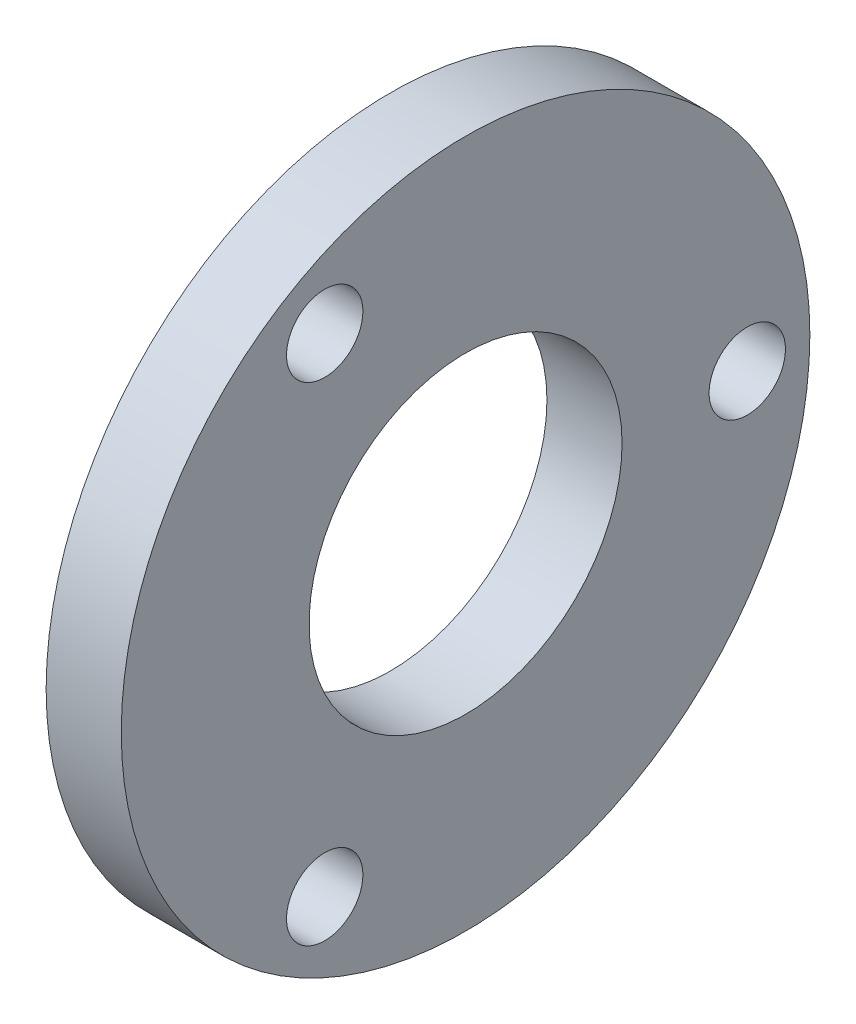
ISO-10303-21;
HEADER;
FILE_DESCRIPTION(('STEP AP214'),'2;1');
FILE_NAME('part.step','',(''),(''),'','','');
FILE_SCHEMA(('AUTOMOTIVE_DESIGN { 1 0 10303 214 1 1 1 1 }'));
ENDSEC;
DATA;
#1=APPLICATION_CONTEXT('core data for automotive mechanical design processes');
#2=APPLICATION_PROTOCOL_DEFINITION('international standard','automotive_design',2000,#1);
#3=PRODUCT_CONTEXT('',#1,'mechanical');
#4=PRODUCT('Part','Part','',(#3));
#5=PRODUCT_RELATED_PRODUCT_CATEGORY('part','',(#4));
#6=PRODUCT_DEFINITION_FORMATION('','',#4);
#7=PRODUCT_DEFINITION_CONTEXT('part definition',#1,'design');
#8=PRODUCT_DEFINITION('design','',#6,#7);
#9=PRODUCT_DEFINITION_SHAPE('','',#8);
#10=(LENGTH_UNIT() NAMED_UNIT(*) SI_UNIT(.MILLI.,.METRE.));
#11=(NAMED_UNIT(*) PLANE_ANGLE_UNIT() SI_UNIT($,.RADIAN.));
#12=(NAMED_UNIT(*) SI_UNIT($,.STERADIAN.) SOLID_ANGLE_UNIT());
#13=UNCERTAINTY_MEASURE_WITH_UNIT(LENGTH_MEASURE(1.E-05),#10,'distance_accuracy_value','');
#14=(GEOMETRIC_REPRESENTATION_CONTEXT(3) GLOBAL_UNCERTAINTY_ASSIGNED_CONTEXT((#13)) GLOBAL_UNIT_ASSIGNED_CONTEXT((#10,
#11,#12)) REPRESENTATION_CONTEXT('',''));
#15=CARTESIAN_POINT('',(0.,0.,0.));
#16=DIRECTION('',(0.,0.,1.));
#17=DIRECTION('',(1.,0.,0.));
#18=AXIS2_PLACEMENT_3D('',#15,#16,#17);
#19=CARTESIAN_POINT('',(6.,0.,0.));
#20=DIRECTION('',(1.,0.,0.));
#21=DIRECTION('',(0.,0.,-1.));
#22=AXIS2_PLACEMENT_3D('',#19,#20,#21);
#23=PLANE('',#22);
#24=CARTESIAN_POINT('',(6.,-19.4855715851497,11.2500000000004));
#25=DIRECTION('',(1.,0.,0.));
#26=DIRECTION('',(0.,0.,-1.));
#27=AXIS2_PLACEMENT_3D('',#24,#25,#26);
#28=CIRCLE('',#27,3.05);
#29=CARTESIAN_POINT('',(6.,-19.4855715851497,8.20000000000037));
#30=VERTEX_POINT('',#29);
#31=EDGE_CURVE('E56',#30,#30,#28,.T.);
#32=ORIENTED_EDGE('',*,*,#31,.F.);
#33=EDGE_LOOP('',(#32));
#34=FACE_BOUND('',#33,.T.);
#35=CARTESIAN_POINT('',(6.,0.,0.));
#36=DIRECTION('',(1.,0.,0.));
#37=DIRECTION('',(0.,0.,-1.));
#38=AXIS2_PLACEMENT_3D('',#35,#36,#37);
#39=CIRCLE('',#38,12.5);
#40=CARTESIAN_POINT('',(6.,0.,-12.5));
#41=VERTEX_POINT('',#40);
#42=EDGE_CURVE('E45',#41,#41,#39,.T.);
#43=ORIENTED_EDGE('',*,*,#42,.F.);
#44=EDGE_LOOP('',(#43));
#45=FACE_BOUND('',#44,.T.);
#46=CARTESIAN_POINT('',(6.,0.,0.));
#47=DIRECTION('',(1.,0.,0.));
#48=DIRECTION('',(0.,0.,-1.));
#49=AXIS2_PLACEMENT_3D('',#46,#47,#48);
#50=CIRCLE('',#49,27.5);
#51=CARTESIAN_POINT('',(6.,0.,-27.5));
#52=VERTEX_POINT('',#51);
#53=EDGE_CURVE('E10',#52,#52,#50,.T.);
#54=ORIENTED_EDGE('',*,*,#53,.T.);
#55=EDGE_LOOP('',(#54));
#56=FACE_BOUND('',#55,.T.);
#57=CARTESIAN_POINT('',(6.,0.,-22.5));
#58=DIRECTION('',(1.,0.,0.));
#59=DIRECTION('',(0.,0.,-1.));
#60=AXIS2_PLACEMENT_3D('',#57,#58,#59);
#61=CIRCLE('',#60,3.05);
#62=CARTESIAN_POINT('',(6.,0.,-25.55));
#63=VERTEX_POINT('',#62);
#64=EDGE_CURVE('E50',#63,#63,#61,.T.);
#65=ORIENTED_EDGE('',*,*,#64,.F.);
#66=EDGE_LOOP('',(#65));
#67=FACE_BOUND('',#66,.T.);
#68=CARTESIAN_POINT('',(6.,19.4855715851501,11.2499999999995));
#69=DIRECTION('',(1.,0.,0.));
#70=DIRECTION('',(0.,0.,-1.));
#71=AXIS2_PLACEMENT_3D('',#68,#69,#70);
#72=CIRCLE('',#71,3.05);
#73=CARTESIAN_POINT('',(6.,19.4855715851501,8.19999999999954));
#74=VERTEX_POINT('',#73);
#75=EDGE_CURVE('E62',#74,#74,#72,.T.);
#76=ORIENTED_EDGE('',*,*,#75,.F.);
#77=EDGE_LOOP('',(#76));
#78=FACE_BOUND('',#77,.T.);
#79=ADVANCED_FACE('F34',(#34,#45,#56,#67,#78),#23,.T.);
#80=CARTESIAN_POINT('',(0.,0.,0.));
#81=DIRECTION('',(1.,0.,0.));
#82=DIRECTION('',(0.,0.,-1.));
#83=AXIS2_PLACEMENT_3D('',#80,#81,#82);
#84=PLANE('',#83);
#85=CARTESIAN_POINT('',(0.,0.,0.));
#86=DIRECTION('',(1.,0.,0.));
#87=DIRECTION('',(0.,0.,-1.));
#88=AXIS2_PLACEMENT_3D('',#85,#86,#87);
#89=CIRCLE('',#88,27.5);
#90=CARTESIAN_POINT('',(0.,0.,-27.5));
#91=VERTEX_POINT('',#90);
#92=EDGE_CURVE('E38',#91,#91,#89,.T.);
#93=ORIENTED_EDGE('',*,*,#92,.F.);
#94=EDGE_LOOP('',(#93));
#95=FACE_BOUND('',#94,.T.);
#96=CARTESIAN_POINT('',(0.,0.,0.));
#97=DIRECTION('',(1.,0.,0.));
#98=DIRECTION('',(0.,0.,-1.));
#99=AXIS2_PLACEMENT_3D('',#96,#97,#98);
#100=CIRCLE('',#99,12.5);
#101=CARTESIAN_POINT('',(0.,0.,-12.5));
#102=VERTEX_POINT('',#101);
#103=EDGE_CURVE('E47',#102,#102,#100,.T.);
#104=ORIENTED_EDGE('',*,*,#103,.T.);
#105=EDGE_LOOP('',(#104));
#106=FACE_BOUND('',#105,.T.);
#107=CARTESIAN_POINT('',(0.,0.,-22.5));
#108=DIRECTION('',(1.,0.,0.));
#109=DIRECTION('',(0.,0.,-1.));
#110=AXIS2_PLACEMENT_3D('',#107,#108,#109);
#111=CIRCLE('',#110,3.05);
#112=CARTESIAN_POINT('',(0.,0.,-25.55));
#113=VERTEX_POINT('',#112);
#114=EDGE_CURVE('E53',#113,#113,#111,.T.);
#115=ORIENTED_EDGE('',*,*,#114,.T.);
#116=EDGE_LOOP('',(#115));
#117=FACE_BOUND('',#116,.T.);
#118=CARTESIAN_POINT('',(0.,-19.4855715851497,11.2500000000004));
#119=DIRECTION('',(1.,0.,0.));
#120=DIRECTION('',(0.,0.,-1.));
#121=AXIS2_PLACEMENT_3D('',#118,#119,#120);
#122=CIRCLE('',#121,3.05);
#123=CARTESIAN_POINT('',(0.,-19.4855715851497,8.20000000000037));
#124=VERTEX_POINT('',#123);
#125=EDGE_CURVE('E59',#124,#124,#122,.T.);
#126=ORIENTED_EDGE('',*,*,#125,.T.);
#127=EDGE_LOOP('',(#126));
#128=FACE_BOUND('',#127,.T.);
#129=CARTESIAN_POINT('',(0.,19.4855715851501,11.2499999999995));
#130=DIRECTION('',(1.,0.,0.));
#131=DIRECTION('',(0.,0.,-1.));
#132=AXIS2_PLACEMENT_3D('',#129,#130,#131);
#133=CIRCLE('',#132,3.05);
#134=CARTESIAN_POINT('',(0.,19.4855715851501,8.19999999999954));
#135=VERTEX_POINT('',#134);
#136=EDGE_CURVE('E65',#135,#135,#133,.T.);
#137=ORIENTED_EDGE('',*,*,#136,.T.);
#138=EDGE_LOOP('',(#137));
#139=FACE_BOUND('',#138,.T.);
#140=ADVANCED_FACE('F75',(#95,#106,#117,#128,#139),#84,.F.);
#141=CARTESIAN_POINT('',(6.,0.,0.));
#142=DIRECTION('',(-1.,0.,0.));
#143=DIRECTION('',(0.,0.,1.));
#144=AXIS2_PLACEMENT_3D('',#141,#142,#143);
#145=CYLINDRICAL_SURFACE('',#144,27.5);
#146=ORIENTED_EDGE('',*,*,#53,.F.);
#147=EDGE_LOOP('',(#146));
#148=FACE_BOUND('',#147,.T.);
#149=ORIENTED_EDGE('',*,*,#92,.T.);
#150=EDGE_LOOP('',(#149));
#151=FACE_BOUND('',#150,.T.);
#152=ADVANCED_FACE('F36',(#148,#151),#145,.T.);
#153=CARTESIAN_POINT('',(6.,0.,0.));
#154=DIRECTION('',(-1.,0.,0.));
#155=DIRECTION('',(0.,0.,1.));
#156=AXIS2_PLACEMENT_3D('',#153,#154,#155);
#157=CYLINDRICAL_SURFACE('',#156,12.5);
#158=ORIENTED_EDGE('',*,*,#42,.T.);
#159=EDGE_LOOP('',(#158));
#160=FACE_BOUND('',#159,.T.);
#161=ORIENTED_EDGE('',*,*,#103,.F.);
#162=EDGE_LOOP('',(#161));
#163=FACE_BOUND('',#162,.T.);
#164=ADVANCED_FACE('F85',(#160,#163),#157,.F.);
#165=CARTESIAN_POINT('',(6.,0.,-22.5));
#166=DIRECTION('',(-1.,0.,0.));
#167=DIRECTION('',(0.,0.,1.));
#168=AXIS2_PLACEMENT_3D('',#165,#166,#167);
#169=CYLINDRICAL_SURFACE('',#168,3.05);
#170=ORIENTED_EDGE('',*,*,#64,.T.);
#171=EDGE_LOOP('',(#170));
#172=FACE_BOUND('',#171,.T.);
#173=ORIENTED_EDGE('',*,*,#114,.F.);
#174=EDGE_LOOP('',(#173));
#175=FACE_BOUND('',#174,.T.);
#176=ADVANCED_FACE('F88',(#172,#175),#169,.F.);
#177=CARTESIAN_POINT('',(6.,-19.4855715851497,11.2500000000004));
#178=DIRECTION('',(-1.,0.,0.));
#179=DIRECTION('',(0.,0.,1.));
#180=AXIS2_PLACEMENT_3D('',#177,#178,#179);
#181=CYLINDRICAL_SURFACE('',#180,3.05);
#182=ORIENTED_EDGE('',*,*,#31,.T.);
#183=EDGE_LOOP('',(#182));
#184=FACE_BOUND('',#183,.T.);
#185=ORIENTED_EDGE('',*,*,#125,.F.);
#186=EDGE_LOOP('',(#185));
#187=FACE_BOUND('',#186,.T.);
#188=ADVANCED_FACE('F92',(#184,#187),#181,.F.);
#189=CARTESIAN_POINT('',(6.,19.4855715851501,11.2499999999995));
#190=DIRECTION('',(-1.,0.,0.));
#191=DIRECTION('',(0.,0.,1.));
#192=AXIS2_PLACEMENT_3D('',#189,#190,#191);
#193=CYLINDRICAL_SURFACE('',#192,3.05);
#194=ORIENTED_EDGE('',*,*,#75,.T.);
#195=EDGE_LOOP('',(#194));
#196=FACE_BOUND('',#195,.T.);
#197=ORIENTED_EDGE('',*,*,#136,.F.);
#198=EDGE_LOOP('',(#197));
#199=FACE_BOUND('',#198,.T.);
#200=ADVANCED_FACE('F71',(#196,#199),#193,.F.);
#201=CLOSED_SHELL('',(#79,#140,#152,#164,#176,#188,#200));
#202=MANIFOLD_SOLID_BREP('B2',#201);
#203=ADVANCED_BREP_SHAPE_REPRESENTATION('',(#18,#202),#14);
#204=SHAPE_DEFINITION_REPRESENTATION(#9,#203);
ENDSEC;
END-ISO-10303-21;
